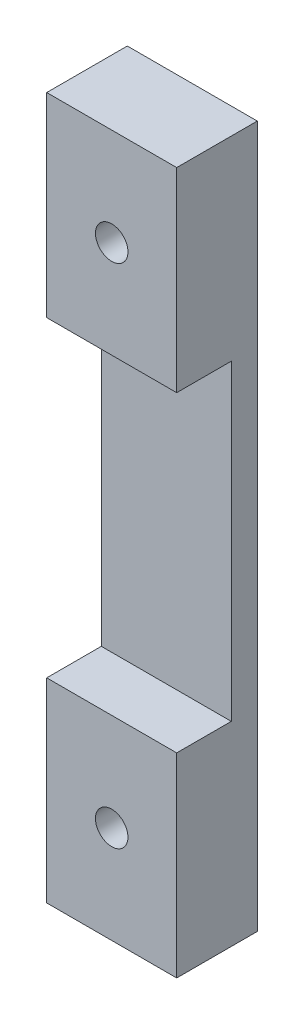
ISO-10303-21;
HEADER;
FILE_DESCRIPTION(('STEP AP214'),'2;1');
FILE_NAME('part.step','',(''),(''),'','','');
FILE_SCHEMA(('AUTOMOTIVE_DESIGN { 1 0 10303 214 1 1 1 1 }'));
ENDSEC;
DATA;
#1=APPLICATION_CONTEXT('core data for automotive mechanical design processes');
#2=APPLICATION_PROTOCOL_DEFINITION('international standard','automotive_design',2000,#1);
#3=PRODUCT_CONTEXT('',#1,'mechanical');
#4=PRODUCT('Part','Part','',(#3));
#5=PRODUCT_RELATED_PRODUCT_CATEGORY('part','',(#4));
#6=PRODUCT_DEFINITION_FORMATION('','',#4);
#7=PRODUCT_DEFINITION_CONTEXT('part definition',#1,'design');
#8=PRODUCT_DEFINITION('design','',#6,#7);
#9=PRODUCT_DEFINITION_SHAPE('','',#8);
#10=(LENGTH_UNIT() NAMED_UNIT(*) SI_UNIT(.MILLI.,.METRE.));
#11=(NAMED_UNIT(*) PLANE_ANGLE_UNIT() SI_UNIT($,.RADIAN.));
#12=(NAMED_UNIT(*) SI_UNIT($,.STERADIAN.) SOLID_ANGLE_UNIT());
#13=UNCERTAINTY_MEASURE_WITH_UNIT(LENGTH_MEASURE(1.E-05),#10,'distance_accuracy_value','');
#14=(GEOMETRIC_REPRESENTATION_CONTEXT(3) GLOBAL_UNCERTAINTY_ASSIGNED_CONTEXT((#13)) GLOBAL_UNIT_ASSIGNED_CONTEXT((#10,
#11,#12)) REPRESENTATION_CONTEXT('',''));
#15=CARTESIAN_POINT('',(0.,0.,0.));
#16=DIRECTION('',(0.,0.,1.));
#17=DIRECTION('',(1.,0.,0.));
#18=AXIS2_PLACEMENT_3D('',#15,#16,#17);
#19=CARTESIAN_POINT('',(0.,0.,2.));
#20=DIRECTION('',(0.,0.,1.));
#21=DIRECTION('',(1.,0.,0.));
#22=AXIS2_PLACEMENT_3D('',#19,#20,#21);
#23=PLANE('',#22);
#24=DIRECTION('',(0.,1.,0.));
#25=VECTOR('',#24,1.);
#26=CARTESIAN_POINT('',(-51.6355653128432,53.7500000000002,2.));
#27=LINE('',#26,#25);
#28=CARTESIAN_POINT('',(-51.6355653128432,14.7500000000002,2.));
#29=VERTEX_POINT('',#28);
#30=CARTESIAN_POINT('',(-51.6355653128432,38.7500000000002,2.));
#31=VERTEX_POINT('',#30);
#32=EDGE_CURVE('E54',#29,#31,#27,.T.);
#33=ORIENTED_EDGE('',*,*,#32,.T.);
#34=DIRECTION('',(1.,0.,0.));
#35=VECTOR('',#34,1.);
#36=CARTESIAN_POINT('',(0.,38.7500000000002,2.));
#37=LINE('',#36,#35);
#38=CARTESIAN_POINT('',(-61.6355653128432,38.7500000000002,2.));
#39=VERTEX_POINT('',#38);
#40=EDGE_CURVE('E49',#39,#31,#37,.T.);
#41=ORIENTED_EDGE('',*,*,#40,.F.);
#42=DIRECTION('',(0.,-1.,0.));
#43=VECTOR('',#42,1.);
#44=CARTESIAN_POINT('',(-61.6355653128432,53.7500000000002,2.));
#45=LINE('',#44,#43);
#46=CARTESIAN_POINT('',(-61.6355653128432,14.7500000000002,2.));
#47=VERTEX_POINT('',#46);
#48=EDGE_CURVE('E121',#39,#47,#45,.T.);
#49=ORIENTED_EDGE('',*,*,#48,.T.);
#50=DIRECTION('',(1.,0.,0.));
#51=VECTOR('',#50,1.);
#52=CARTESIAN_POINT('',(0.,14.7500000000002,2.));
#53=LINE('',#52,#51);
#54=EDGE_CURVE('E122',#47,#29,#53,.T.);
#55=ORIENTED_EDGE('',*,*,#54,.T.);
#56=EDGE_LOOP('',(#33,#41,#49,#55));
#57=FACE_BOUND('',#56,.T.);
#58=ADVANCED_FACE('F34',(#57),#23,.T.);
#59=CARTESIAN_POINT('',(-61.6355653128432,53.7500000000002,2.));
#60=DIRECTION('',(1.,0.,0.));
#61=DIRECTION('',(0.,1.,0.));
#62=AXIS2_PLACEMENT_3D('',#59,#60,#61);
#63=PLANE('',#62);
#64=DIRECTION('',(0.,-1.,0.));
#65=VECTOR('',#64,1.);
#66=CARTESIAN_POINT('',(-61.6355653128432,53.7500000000002,0.));
#67=LINE('',#66,#65);
#68=CARTESIAN_POINT('',(-61.6355653128432,53.7500000000002,0.));
#69=VERTEX_POINT('',#68);
#70=CARTESIAN_POINT('',(-61.6355653128432,-0.249999999999757,0.));
#71=VERTEX_POINT('',#70);
#72=EDGE_CURVE('E143',#69,#71,#67,.T.);
#73=ORIENTED_EDGE('',*,*,#72,.T.);
#74=DIRECTION('',(0.,0.,-1.));
#75=VECTOR('',#74,1.);
#76=CARTESIAN_POINT('',(-61.6355653128432,-0.249999999999757,2.));
#77=LINE('',#76,#75);
#78=CARTESIAN_POINT('',(-61.6355653128432,-0.249999999999757,6.2));
#79=VERTEX_POINT('',#78);
#80=EDGE_CURVE('E11',#79,#71,#77,.T.);
#81=ORIENTED_EDGE('',*,*,#80,.F.);
#82=DIRECTION('',(0.,-1.,0.));
#83=VECTOR('',#82,1.);
#84=CARTESIAN_POINT('',(-61.6355653128432,0.,6.2));
#85=LINE('',#84,#83);
#86=CARTESIAN_POINT('',(-61.6355653128432,14.7500000000002,6.2));
#87=VERTEX_POINT('',#86);
#88=EDGE_CURVE('E131',#87,#79,#85,.T.);
#89=ORIENTED_EDGE('',*,*,#88,.F.);
#90=DIRECTION('',(0.,0.,-1.));
#91=VECTOR('',#90,1.);
#92=CARTESIAN_POINT('',(-61.6355653128432,14.7500000000002,6.2));
#93=LINE('',#92,#91);
#94=EDGE_CURVE('E141',#87,#47,#93,.T.);
#95=ORIENTED_EDGE('',*,*,#94,.T.);
#96=ORIENTED_EDGE('',*,*,#48,.F.);
#97=DIRECTION('',(0.,0.,-1.));
#98=VECTOR('',#97,1.);
#99=CARTESIAN_POINT('',(-61.6355653128432,38.7500000000002,6.2));
#100=LINE('',#99,#98);
#101=CARTESIAN_POINT('',(-61.6355653128432,38.7500000000002,6.2));
#102=VERTEX_POINT('',#101);
#103=EDGE_CURVE('E102',#102,#39,#100,.T.);
#104=ORIENTED_EDGE('',*,*,#103,.F.);
#105=DIRECTION('',(0.,-1.,0.));
#106=VECTOR('',#105,1.);
#107=CARTESIAN_POINT('',(-61.6355653128432,0.,6.2));
#108=LINE('',#107,#106);
#109=CARTESIAN_POINT('',(-61.6355653128432,53.7500000000002,6.2));
#110=VERTEX_POINT('',#109);
#111=EDGE_CURVE('E109',#110,#102,#108,.T.);
#112=ORIENTED_EDGE('',*,*,#111,.F.);
#113=DIRECTION('',(0.,0.,-1.));
#114=VECTOR('',#113,1.);
#115=CARTESIAN_POINT('',(-61.6355653128432,53.7500000000002,2.));
#116=LINE('',#115,#114);
#117=EDGE_CURVE('E147',#110,#69,#116,.T.);
#118=ORIENTED_EDGE('',*,*,#117,.T.);
#119=EDGE_LOOP('',(#73,#81,#89,#95,#96,#104,#112,#118));
#120=FACE_BOUND('',#119,.T.);
#121=ADVANCED_FACE('F36',(#120),#63,.F.);
#122=CARTESIAN_POINT('',(-61.6355653128432,-0.249999999999757,2.));
#123=DIRECTION('',(0.,1.,0.));
#124=DIRECTION('',(0.,0.,1.));
#125=AXIS2_PLACEMENT_3D('',#122,#123,#124);
#126=PLANE('',#125);
#127=DIRECTION('',(1.,0.,0.));
#128=VECTOR('',#127,1.);
#129=CARTESIAN_POINT('',(-61.6355653128432,-0.249999999999757,0.));
#130=LINE('',#129,#128);
#131=CARTESIAN_POINT('',(-51.6355653128432,-0.249999999999757,0.));
#132=VERTEX_POINT('',#131);
#133=EDGE_CURVE('E149',#71,#132,#130,.T.);
#134=ORIENTED_EDGE('',*,*,#133,.T.);
#135=DIRECTION('',(0.,0.,-1.));
#136=VECTOR('',#135,1.);
#137=CARTESIAN_POINT('',(-51.6355653128432,-0.249999999999757,2.));
#138=LINE('',#137,#136);
#139=CARTESIAN_POINT('',(-51.6355653128432,-0.249999999999757,6.2));
#140=VERTEX_POINT('',#139);
#141=EDGE_CURVE('E42',#140,#132,#138,.T.);
#142=ORIENTED_EDGE('',*,*,#141,.F.);
#143=DIRECTION('',(1.,0.,0.));
#144=VECTOR('',#143,1.);
#145=CARTESIAN_POINT('',(0.,-0.249999999999757,6.2));
#146=LINE('',#145,#144);
#147=EDGE_CURVE('E134',#79,#140,#146,.T.);
#148=ORIENTED_EDGE('',*,*,#147,.F.);
#149=ORIENTED_EDGE('',*,*,#80,.T.);
#150=EDGE_LOOP('',(#134,#142,#148,#149));
#151=FACE_BOUND('',#150,.T.);
#152=ADVANCED_FACE('F175',(#151),#126,.F.);
#153=CARTESIAN_POINT('',(-51.6355653128432,53.7500000000002,2.));
#154=DIRECTION('',(-1.,0.,0.));
#155=DIRECTION('',(0.,-1.,0.));
#156=AXIS2_PLACEMENT_3D('',#153,#154,#155);
#157=PLANE('',#156);
#158=DIRECTION('',(0.,1.,0.));
#159=VECTOR('',#158,1.);
#160=CARTESIAN_POINT('',(-51.6355653128432,53.7500000000002,0.));
#161=LINE('',#160,#159);
#162=CARTESIAN_POINT('',(-51.6355653128432,53.7500000000002,0.));
#163=VERTEX_POINT('',#162);
#164=EDGE_CURVE('E151',#132,#163,#161,.T.);
#165=ORIENTED_EDGE('',*,*,#164,.T.);
#166=DIRECTION('',(0.,0.,-1.));
#167=VECTOR('',#166,1.);
#168=CARTESIAN_POINT('',(-51.6355653128432,53.7500000000002,2.));
#169=LINE('',#168,#167);
#170=CARTESIAN_POINT('',(-51.6355653128432,53.7500000000002,6.2));
#171=VERTEX_POINT('',#170);
#172=EDGE_CURVE('E155',#171,#163,#169,.T.);
#173=ORIENTED_EDGE('',*,*,#172,.F.);
#174=DIRECTION('',(0.,1.,0.));
#175=VECTOR('',#174,1.);
#176=CARTESIAN_POINT('',(-51.6355653128432,0.,6.2));
#177=LINE('',#176,#175);
#178=CARTESIAN_POINT('',(-51.6355653128432,38.7500000000002,6.2));
#179=VERTEX_POINT('',#178);
#180=EDGE_CURVE('E108',#179,#171,#177,.T.);
#181=ORIENTED_EDGE('',*,*,#180,.F.);
#182=DIRECTION('',(0.,0.,-1.));
#183=VECTOR('',#182,1.);
#184=CARTESIAN_POINT('',(-51.6355653128432,38.7500000000002,6.2));
#185=LINE('',#184,#183);
#186=EDGE_CURVE('E104',#179,#31,#185,.T.);
#187=ORIENTED_EDGE('',*,*,#186,.T.);
#188=ORIENTED_EDGE('',*,*,#32,.F.);
#189=DIRECTION('',(0.,0.,-1.));
#190=VECTOR('',#189,1.);
#191=CARTESIAN_POINT('',(-51.6355653128432,14.7500000000002,6.2));
#192=LINE('',#191,#190);
#193=CARTESIAN_POINT('',(-51.6355653128432,14.7500000000002,6.2));
#194=VERTEX_POINT('',#193);
#195=EDGE_CURVE('E138',#194,#29,#192,.T.);
#196=ORIENTED_EDGE('',*,*,#195,.F.);
#197=DIRECTION('',(0.,1.,0.));
#198=VECTOR('',#197,1.);
#199=CARTESIAN_POINT('',(-51.6355653128432,0.,6.2));
#200=LINE('',#199,#198);
#201=EDGE_CURVE('E137',#140,#194,#200,.T.);
#202=ORIENTED_EDGE('',*,*,#201,.F.);
#203=ORIENTED_EDGE('',*,*,#141,.T.);
#204=EDGE_LOOP('',(#165,#173,#181,#187,#188,#196,#202,#203));
#205=FACE_BOUND('',#204,.T.);
#206=ADVANCED_FACE('F161',(#205),#157,.F.);
#207=CARTESIAN_POINT('',(-61.6355653128432,53.7500000000002,2.));
#208=DIRECTION('',(0.,-1.,0.));
#209=DIRECTION('',(0.,0.,-1.));
#210=AXIS2_PLACEMENT_3D('',#207,#208,#209);
#211=PLANE('',#210);
#212=DIRECTION('',(-1.,0.,0.));
#213=VECTOR('',#212,1.);
#214=CARTESIAN_POINT('',(-61.6355653128432,53.7500000000002,0.));
#215=LINE('',#214,#213);
#216=EDGE_CURVE('E145',#163,#69,#215,.T.);
#217=ORIENTED_EDGE('',*,*,#216,.T.);
#218=ORIENTED_EDGE('',*,*,#117,.F.);
#219=DIRECTION('',(-1.,0.,0.));
#220=VECTOR('',#219,1.);
#221=CARTESIAN_POINT('',(0.,53.7500000000002,6.2));
#222=LINE('',#221,#220);
#223=EDGE_CURVE('E115',#171,#110,#222,.T.);
#224=ORIENTED_EDGE('',*,*,#223,.F.);
#225=ORIENTED_EDGE('',*,*,#172,.T.);
#226=EDGE_LOOP('',(#217,#218,#224,#225));
#227=FACE_BOUND('',#226,.T.);
#228=ADVANCED_FACE('F170',(#227),#211,.F.);
#229=CARTESIAN_POINT('',(0.,0.,0.));
#230=DIRECTION('',(0.,0.,1.));
#231=DIRECTION('',(1.,0.,0.));
#232=AXIS2_PLACEMENT_3D('',#229,#230,#231);
#233=PLANE('',#232);
#234=CARTESIAN_POINT('',(-56.6355653128432,46.2500000000002,0.));
#235=DIRECTION('',(0.,0.,1.));
#236=DIRECTION('',(1.,0.,0.));
#237=AXIS2_PLACEMENT_3D('',#234,#235,#236);
#238=CIRCLE('',#237,1.25);
#239=CARTESIAN_POINT('',(-55.3855653128432,46.2500000000002,0.));
#240=VERTEX_POINT('',#239);
#241=EDGE_CURVE('E318',#240,#240,#238,.T.);
#242=ORIENTED_EDGE('',*,*,#241,.T.);
#243=EDGE_LOOP('',(#242));
#244=FACE_BOUND('',#243,.T.);
#245=CARTESIAN_POINT('',(-56.6355653128432,7.25000000000024,0.));
#246=DIRECTION('',(0.,0.,1.));
#247=DIRECTION('',(1.,0.,0.));
#248=AXIS2_PLACEMENT_3D('',#245,#246,#247);
#249=CIRCLE('',#248,1.25);
#250=CARTESIAN_POINT('',(-55.3855653128432,7.25000000000024,0.));
#251=VERTEX_POINT('',#250);
#252=EDGE_CURVE('E326',#251,#251,#249,.T.);
#253=ORIENTED_EDGE('',*,*,#252,.T.);
#254=EDGE_LOOP('',(#253));
#255=FACE_BOUND('',#254,.T.);
#256=ORIENTED_EDGE('',*,*,#72,.F.);
#257=ORIENTED_EDGE('',*,*,#216,.F.);
#258=ORIENTED_EDGE('',*,*,#164,.F.);
#259=ORIENTED_EDGE('',*,*,#133,.F.);
#260=EDGE_LOOP('',(#256,#257,#258,#259));
#261=FACE_BOUND('',#260,.T.);
#262=ADVANCED_FACE('F168',(#244,#255,#261),#233,.F.);
#263=CARTESIAN_POINT('',(0.,14.7500000000002,6.2));
#264=DIRECTION('',(0.,1.,0.));
#265=DIRECTION('',(0.,0.,1.));
#266=AXIS2_PLACEMENT_3D('',#263,#264,#265);
#267=PLANE('',#266);
#268=ORIENTED_EDGE('',*,*,#54,.F.);
#269=ORIENTED_EDGE('',*,*,#94,.F.);
#270=DIRECTION('',(1.,0.,0.));
#271=VECTOR('',#270,1.);
#272=CARTESIAN_POINT('',(0.,14.7500000000002,6.2));
#273=LINE('',#272,#271);
#274=EDGE_CURVE('E124',#87,#194,#273,.T.);
#275=ORIENTED_EDGE('',*,*,#274,.T.);
#276=ORIENTED_EDGE('',*,*,#195,.T.);
#277=EDGE_LOOP('',(#268,#269,#275,#276));
#278=FACE_BOUND('',#277,.T.);
#279=ADVANCED_FACE('F188',(#278),#267,.T.);
#280=CARTESIAN_POINT('',(0.,0.,6.2));
#281=DIRECTION('',(0.,0.,1.));
#282=DIRECTION('',(1.,0.,0.));
#283=AXIS2_PLACEMENT_3D('',#280,#281,#282);
#284=PLANE('',#283);
#285=CARTESIAN_POINT('',(-56.6355653128432,7.25000000000024,6.2));
#286=DIRECTION('',(0.,0.,1.));
#287=DIRECTION('',(1.,0.,0.));
#288=AXIS2_PLACEMENT_3D('',#285,#286,#287);
#289=CIRCLE('',#288,1.25);
#290=CARTESIAN_POINT('',(-55.3855653128432,7.25000000000024,6.2));
#291=VERTEX_POINT('',#290);
#292=EDGE_CURVE('E323',#291,#291,#289,.T.);
#293=ORIENTED_EDGE('',*,*,#292,.F.);
#294=EDGE_LOOP('',(#293));
#295=FACE_BOUND('',#294,.T.);
#296=ORIENTED_EDGE('',*,*,#274,.F.);
#297=ORIENTED_EDGE('',*,*,#88,.T.);
#298=ORIENTED_EDGE('',*,*,#147,.T.);
#299=ORIENTED_EDGE('',*,*,#201,.T.);
#300=EDGE_LOOP('',(#296,#297,#298,#299));
#301=FACE_BOUND('',#300,.T.);
#302=ADVANCED_FACE('F174',(#295,#301),#284,.T.);
#303=CARTESIAN_POINT('',(0.,38.7500000000002,6.2));
#304=DIRECTION('',(0.,1.,0.));
#305=DIRECTION('',(0.,0.,1.));
#306=AXIS2_PLACEMENT_3D('',#303,#304,#305);
#307=PLANE('',#306);
#308=ORIENTED_EDGE('',*,*,#40,.T.);
#309=ORIENTED_EDGE('',*,*,#186,.F.);
#310=DIRECTION('',(1.,0.,0.));
#311=VECTOR('',#310,1.);
#312=CARTESIAN_POINT('',(0.,38.7500000000002,6.2));
#313=LINE('',#312,#311);
#314=EDGE_CURVE('E98',#102,#179,#313,.T.);
#315=ORIENTED_EDGE('',*,*,#314,.F.);
#316=ORIENTED_EDGE('',*,*,#103,.T.);
#317=EDGE_LOOP('',(#308,#309,#315,#316));
#318=FACE_BOUND('',#317,.T.);
#319=ADVANCED_FACE('F100',(#318),#307,.F.);
#320=CARTESIAN_POINT('',(0.,0.,6.2));
#321=DIRECTION('',(0.,0.,1.));
#322=DIRECTION('',(1.,0.,0.));
#323=AXIS2_PLACEMENT_3D('',#320,#321,#322);
#324=PLANE('',#323);
#325=CARTESIAN_POINT('',(-56.6355653128432,46.2500000000002,6.2));
#326=DIRECTION('',(0.,0.,1.));
#327=DIRECTION('',(1.,0.,0.));
#328=AXIS2_PLACEMENT_3D('',#325,#326,#327);
#329=CIRCLE('',#328,1.25);
#330=CARTESIAN_POINT('',(-55.3855653128432,46.2500000000002,6.2));
#331=VERTEX_POINT('',#330);
#332=EDGE_CURVE('E321',#331,#331,#329,.T.);
#333=ORIENTED_EDGE('',*,*,#332,.F.);
#334=EDGE_LOOP('',(#333));
#335=FACE_BOUND('',#334,.T.);
#336=ORIENTED_EDGE('',*,*,#111,.T.);
#337=ORIENTED_EDGE('',*,*,#314,.T.);
#338=ORIENTED_EDGE('',*,*,#180,.T.);
#339=ORIENTED_EDGE('',*,*,#223,.T.);
#340=EDGE_LOOP('',(#336,#337,#338,#339));
#341=FACE_BOUND('',#340,.T.);
#342=ADVANCED_FACE('F113',(#335,#341),#324,.T.);
#343=CARTESIAN_POINT('',(-56.6355653128432,7.25000000000024,0.));
#344=DIRECTION('',(0.,0.,1.));
#345=DIRECTION('',(1.,0.,0.));
#346=AXIS2_PLACEMENT_3D('',#343,#344,#345);
#347=CYLINDRICAL_SURFACE('',#346,1.25);
#348=ORIENTED_EDGE('',*,*,#252,.F.);
#349=EDGE_LOOP('',(#348));
#350=FACE_BOUND('',#349,.T.);
#351=ORIENTED_EDGE('',*,*,#292,.T.);
#352=EDGE_LOOP('',(#351));
#353=FACE_BOUND('',#352,.T.);
#354=ADVANCED_FACE('F226',(#350,#353),#347,.F.);
#355=CARTESIAN_POINT('',(-56.6355653128432,46.2500000000002,0.));
#356=DIRECTION('',(0.,0.,1.));
#357=DIRECTION('',(1.,0.,0.));
#358=AXIS2_PLACEMENT_3D('',#355,#356,#357);
#359=CYLINDRICAL_SURFACE('',#358,1.25);
#360=ORIENTED_EDGE('',*,*,#241,.F.);
#361=EDGE_LOOP('',(#360));
#362=FACE_BOUND('',#361,.T.);
#363=ORIENTED_EDGE('',*,*,#332,.T.);
#364=EDGE_LOOP('',(#363));
#365=FACE_BOUND('',#364,.T.);
#366=ADVANCED_FACE('F234',(#362,#365),#359,.F.);
#367=CLOSED_SHELL('',(#58,#121,#152,#206,#228,#262,#279,#302,#319,#342,#354,#366));
#368=MANIFOLD_SOLID_BREP('B2',#367);
#369=ADVANCED_BREP_SHAPE_REPRESENTATION('',(#18,#368),#14);
#370=SHAPE_DEFINITION_REPRESENTATION(#9,#369);
ENDSEC;
END-ISO-10303-21;
